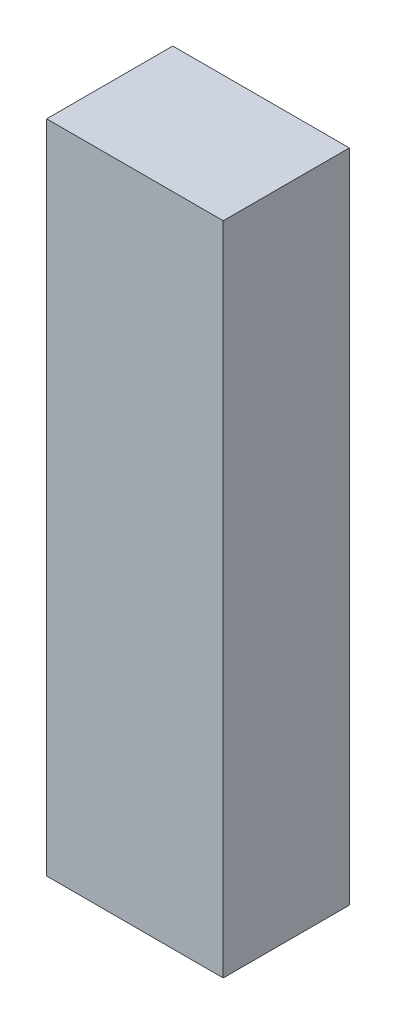
ISO-10303-21;
HEADER;
FILE_DESCRIPTION(('STEP AP214'),'2;1');
FILE_NAME('part.step','',(''),(''),'','','');
FILE_SCHEMA(('AUTOMOTIVE_DESIGN { 1 0 10303 214 1 1 1 1 }'));
ENDSEC;
DATA;
#1=APPLICATION_CONTEXT('core data for automotive mechanical design processes');
#2=APPLICATION_PROTOCOL_DEFINITION('international standard','automotive_design',2000,#1);
#3=PRODUCT_CONTEXT('',#1,'mechanical');
#4=PRODUCT('Part','Part','',(#3));
#5=PRODUCT_RELATED_PRODUCT_CATEGORY('part','',(#4));
#6=PRODUCT_DEFINITION_FORMATION('','',#4);
#7=PRODUCT_DEFINITION_CONTEXT('part definition',#1,'design');
#8=PRODUCT_DEFINITION('design','',#6,#7);
#9=PRODUCT_DEFINITION_SHAPE('','',#8);
#10=(LENGTH_UNIT() NAMED_UNIT(*) SI_UNIT(.MILLI.,.METRE.));
#11=(NAMED_UNIT(*) PLANE_ANGLE_UNIT() SI_UNIT($,.RADIAN.));
#12=(NAMED_UNIT(*) SI_UNIT($,.STERADIAN.) SOLID_ANGLE_UNIT());
#13=UNCERTAINTY_MEASURE_WITH_UNIT(LENGTH_MEASURE(1.E-05),#10,'distance_accuracy_value','');
#14=(GEOMETRIC_REPRESENTATION_CONTEXT(3) GLOBAL_UNCERTAINTY_ASSIGNED_CONTEXT((#13)) GLOBAL_UNIT_ASSIGNED_CONTEXT((#10,
#11,#12)) REPRESENTATION_CONTEXT('',''));
#15=CARTESIAN_POINT('',(0.,0.,0.));
#16=DIRECTION('',(0.,0.,1.));
#17=DIRECTION('',(1.,0.,0.));
#18=AXIS2_PLACEMENT_3D('',#15,#16,#17);
#19=CARTESIAN_POINT('',(-7.,-26.,-10.));
#20=DIRECTION('',(-1.,0.,0.));
#21=DIRECTION('',(0.,0.,1.));
#22=AXIS2_PLACEMENT_3D('',#19,#20,#21);
#23=PLANE('',#22);
#24=DIRECTION('',(0.,-1.,0.));
#25=VECTOR('',#24,1.);
#26=CARTESIAN_POINT('',(-7.,-26.,0.));
#27=LINE('',#26,#25);
#28=CARTESIAN_POINT('',(-7.,26.,0.));
#29=VERTEX_POINT('',#28);
#30=CARTESIAN_POINT('',(-7.,-26.,0.));
#31=VERTEX_POINT('',#30);
#32=EDGE_CURVE('E103',#29,#31,#27,.T.);
#33=ORIENTED_EDGE('',*,*,#32,.F.);
#34=DIRECTION('',(0.,0.,1.));
#35=VECTOR('',#34,1.);
#36=CARTESIAN_POINT('',(-7.,26.,-10.));
#37=LINE('',#36,#35);
#38=CARTESIAN_POINT('',(-7.,26.,-10.));
#39=VERTEX_POINT('',#38);
#40=EDGE_CURVE('E11',#39,#29,#37,.T.);
#41=ORIENTED_EDGE('',*,*,#40,.F.);
#42=DIRECTION('',(0.,-1.,0.));
#43=VECTOR('',#42,1.);
#44=CARTESIAN_POINT('',(-7.,-26.,-10.));
#45=LINE('',#44,#43);
#46=CARTESIAN_POINT('',(-7.,-26.,-10.));
#47=VERTEX_POINT('',#46);
#48=EDGE_CURVE('E97',#39,#47,#45,.T.);
#49=ORIENTED_EDGE('',*,*,#48,.T.);
#50=DIRECTION('',(0.,0.,1.));
#51=VECTOR('',#50,1.);
#52=CARTESIAN_POINT('',(-7.,-26.,-10.));
#53=LINE('',#52,#51);
#54=EDGE_CURVE('E42',#47,#31,#53,.T.);
#55=ORIENTED_EDGE('',*,*,#54,.T.);
#56=EDGE_LOOP('',(#33,#41,#49,#55));
#57=FACE_BOUND('',#56,.T.);
#58=ADVANCED_FACE('F39',(#57),#23,.T.);
#59=CARTESIAN_POINT('',(-7.,26.,-10.));
#60=DIRECTION('',(0.,1.,0.));
#61=DIRECTION('',(0.,0.,1.));
#62=AXIS2_PLACEMENT_3D('',#59,#60,#61);
#63=PLANE('',#62);
#64=DIRECTION('',(-1.,0.,0.));
#65=VECTOR('',#64,1.);
#66=CARTESIAN_POINT('',(-7.,26.,0.));
#67=LINE('',#66,#65);
#68=CARTESIAN_POINT('',(7.,26.,0.));
#69=VERTEX_POINT('',#68);
#70=EDGE_CURVE('E99',#69,#29,#67,.T.);
#71=ORIENTED_EDGE('',*,*,#70,.F.);
#72=DIRECTION('',(0.,0.,1.));
#73=VECTOR('',#72,1.);
#74=CARTESIAN_POINT('',(7.,26.,-10.));
#75=LINE('',#74,#73);
#76=CARTESIAN_POINT('',(7.,26.,-10.));
#77=VERTEX_POINT('',#76);
#78=EDGE_CURVE('E48',#77,#69,#75,.T.);
#79=ORIENTED_EDGE('',*,*,#78,.F.);
#80=DIRECTION('',(-1.,0.,0.));
#81=VECTOR('',#80,1.);
#82=CARTESIAN_POINT('',(-7.,26.,-10.));
#83=LINE('',#82,#81);
#84=EDGE_CURVE('E94',#77,#39,#83,.T.);
#85=ORIENTED_EDGE('',*,*,#84,.T.);
#86=ORIENTED_EDGE('',*,*,#40,.T.);
#87=EDGE_LOOP('',(#71,#79,#85,#86));
#88=FACE_BOUND('',#87,.T.);
#89=ADVANCED_FACE('F113',(#88),#63,.T.);
#90=CARTESIAN_POINT('',(7.,-26.,-10.));
#91=DIRECTION('',(1.,0.,0.));
#92=DIRECTION('',(0.,0.,-1.));
#93=AXIS2_PLACEMENT_3D('',#90,#91,#92);
#94=PLANE('',#93);
#95=DIRECTION('',(0.,1.,0.));
#96=VECTOR('',#95,1.);
#97=CARTESIAN_POINT('',(7.,-26.,0.));
#98=LINE('',#97,#96);
#99=CARTESIAN_POINT('',(7.,-26.,0.));
#100=VERTEX_POINT('',#99);
#101=EDGE_CURVE('E89',#100,#69,#98,.T.);
#102=ORIENTED_EDGE('',*,*,#101,.F.);
#103=DIRECTION('',(0.,0.,1.));
#104=VECTOR('',#103,1.);
#105=CARTESIAN_POINT('',(7.,-26.,-10.));
#106=LINE('',#105,#104);
#107=CARTESIAN_POINT('',(7.,-26.,-10.));
#108=VERTEX_POINT('',#107);
#109=EDGE_CURVE('E84',#108,#100,#106,.T.);
#110=ORIENTED_EDGE('',*,*,#109,.F.);
#111=DIRECTION('',(0.,1.,0.));
#112=VECTOR('',#111,1.);
#113=CARTESIAN_POINT('',(7.,-26.,-10.));
#114=LINE('',#113,#112);
#115=EDGE_CURVE('E87',#108,#77,#114,.T.);
#116=ORIENTED_EDGE('',*,*,#115,.T.);
#117=ORIENTED_EDGE('',*,*,#78,.T.);
#118=EDGE_LOOP('',(#102,#110,#116,#117));
#119=FACE_BOUND('',#118,.T.);
#120=ADVANCED_FACE('F86',(#119),#94,.T.);
#121=CARTESIAN_POINT('',(-7.,-26.,-10.));
#122=DIRECTION('',(0.,-1.,0.));
#123=DIRECTION('',(0.,0.,-1.));
#124=AXIS2_PLACEMENT_3D('',#121,#122,#123);
#125=PLANE('',#124);
#126=DIRECTION('',(1.,0.,0.));
#127=VECTOR('',#126,1.);
#128=CARTESIAN_POINT('',(-7.,-26.,0.));
#129=LINE('',#128,#127);
#130=EDGE_CURVE('E106',#31,#100,#129,.T.);
#131=ORIENTED_EDGE('',*,*,#130,.F.);
#132=ORIENTED_EDGE('',*,*,#54,.F.);
#133=DIRECTION('',(1.,0.,0.));
#134=VECTOR('',#133,1.);
#135=CARTESIAN_POINT('',(-7.,-26.,-10.));
#136=LINE('',#135,#134);
#137=EDGE_CURVE('E93',#47,#108,#136,.T.);
#138=ORIENTED_EDGE('',*,*,#137,.T.);
#139=ORIENTED_EDGE('',*,*,#109,.T.);
#140=EDGE_LOOP('',(#131,#132,#138,#139));
#141=FACE_BOUND('',#140,.T.);
#142=ADVANCED_FACE('F96',(#141),#125,.T.);
#143=CARTESIAN_POINT('',(0.,0.,-10.));
#144=DIRECTION('',(0.,0.,-1.));
#145=DIRECTION('',(-1.,0.,0.));
#146=AXIS2_PLACEMENT_3D('',#143,#144,#145);
#147=PLANE('',#146);
#148=ORIENTED_EDGE('',*,*,#48,.F.);
#149=ORIENTED_EDGE('',*,*,#84,.F.);
#150=ORIENTED_EDGE('',*,*,#115,.F.);
#151=ORIENTED_EDGE('',*,*,#137,.F.);
#152=EDGE_LOOP('',(#148,#149,#150,#151));
#153=FACE_BOUND('',#152,.T.);
#154=ADVANCED_FACE('F92',(#153),#147,.T.);
#155=CARTESIAN_POINT('',(0.,0.,0.));
#156=DIRECTION('',(0.,0.,-1.));
#157=DIRECTION('',(-1.,0.,0.));
#158=AXIS2_PLACEMENT_3D('',#155,#156,#157);
#159=PLANE('',#158);
#160=ORIENTED_EDGE('',*,*,#32,.T.);
#161=ORIENTED_EDGE('',*,*,#130,.T.);
#162=ORIENTED_EDGE('',*,*,#101,.T.);
#163=ORIENTED_EDGE('',*,*,#70,.T.);
#164=EDGE_LOOP('',(#160,#161,#162,#163));
#165=FACE_BOUND('',#164,.T.);
#166=ADVANCED_FACE('F112',(#165),#159,.F.);
#167=CLOSED_SHELL('',(#58,#89,#120,#142,#154,#166));
#168=MANIFOLD_SOLID_BREP('B2',#167);
#169=ADVANCED_BREP_SHAPE_REPRESENTATION('',(#18,#168),#14);
#170=SHAPE_DEFINITION_REPRESENTATION(#9,#169);
ENDSEC;
END-ISO-10303-21;
